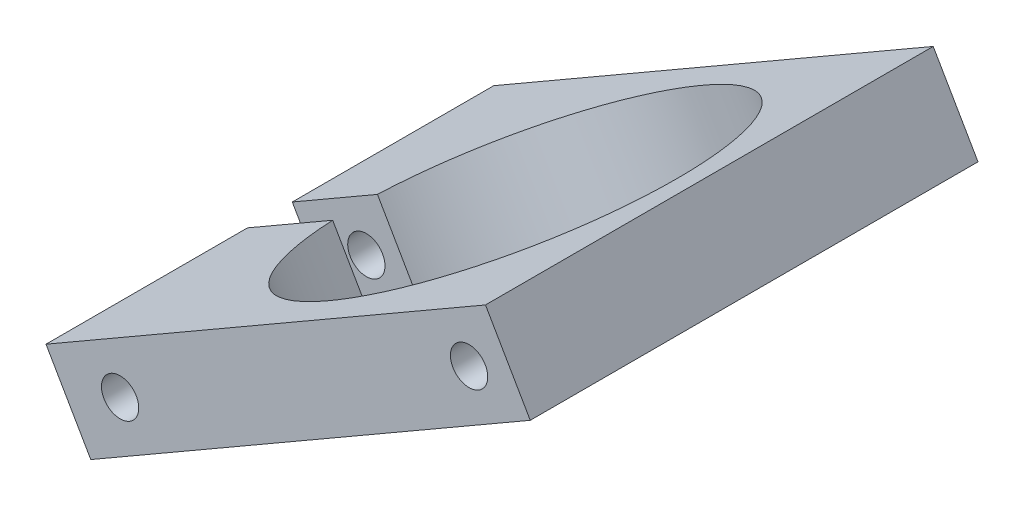
ISO-10303-21;
HEADER;
FILE_DESCRIPTION(('STEP AP214'),'2;1');
FILE_NAME('part.step','',(''),(''),'','','');
FILE_SCHEMA(('AUTOMOTIVE_DESIGN { 1 0 10303 214 1 1 1 1 }'));
ENDSEC;
DATA;
#1=APPLICATION_CONTEXT('core data for automotive mechanical design processes');
#2=APPLICATION_PROTOCOL_DEFINITION('international standard','automotive_design',2000,#1);
#3=PRODUCT_CONTEXT('',#1,'mechanical');
#4=PRODUCT('Part','Part','',(#3));
#5=PRODUCT_RELATED_PRODUCT_CATEGORY('part','',(#4));
#6=PRODUCT_DEFINITION_FORMATION('','',#4);
#7=PRODUCT_DEFINITION_CONTEXT('part definition',#1,'design');
#8=PRODUCT_DEFINITION('design','',#6,#7);
#9=PRODUCT_DEFINITION_SHAPE('','',#8);
#10=(LENGTH_UNIT() NAMED_UNIT(*) SI_UNIT(.MILLI.,.METRE.));
#11=(NAMED_UNIT(*) PLANE_ANGLE_UNIT() SI_UNIT($,.RADIAN.));
#12=(NAMED_UNIT(*) SI_UNIT($,.STERADIAN.) SOLID_ANGLE_UNIT());
#13=UNCERTAINTY_MEASURE_WITH_UNIT(LENGTH_MEASURE(1.E-05),#10,'distance_accuracy_value','');
#14=(GEOMETRIC_REPRESENTATION_CONTEXT(3) GLOBAL_UNCERTAINTY_ASSIGNED_CONTEXT((#13)) GLOBAL_UNIT_ASSIGNED_CONTEXT((#10,
#11,#12)) REPRESENTATION_CONTEXT('',''));
#15=CARTESIAN_POINT('',(0.,0.,0.));
#16=DIRECTION('',(0.,0.,1.));
#17=DIRECTION('',(1.,0.,0.));
#18=AXIS2_PLACEMENT_3D('',#15,#16,#17);
#19=CARTESIAN_POINT('',(-53.9903810567648,730.846095396544,-386.357743681072));
#20=DIRECTION('',(0.,0.,-1.));
#21=DIRECTION('',(0.,1.,0.));
#22=AXIS2_PLACEMENT_3D('',#19,#20,#21);
#23=CYLINDRICAL_SURFACE('',#22,1.25);
#24=CARTESIAN_POINT('',(-53.9903810567648,730.846095396544,-387.857743681072));
#25=DIRECTION('',(0.,0.,-1.));
#26=DIRECTION('',(0.,1.,0.));
#27=AXIS2_PLACEMENT_3D('',#24,#25,#26);
#28=CIRCLE('',#27,1.25);
#29=CARTESIAN_POINT('',(-53.9903810567648,732.096095396544,-387.857743681072));
#30=VERTEX_POINT('',#29);
#31=EDGE_CURVE('E129',#30,#30,#28,.T.);
#32=ORIENTED_EDGE('',*,*,#31,.F.);
#33=EDGE_LOOP('',(#32));
#34=FACE_BOUND('',#33,.T.);
#35=CARTESIAN_POINT('',(-53.9903810567648,730.846095396544,-401.357743681072));
#36=DIRECTION('',(0.,0.,-1.));
#37=DIRECTION('',(0.,1.,0.));
#38=AXIS2_PLACEMENT_3D('',#35,#36,#37);
#39=CIRCLE('',#38,1.25);
#40=CARTESIAN_POINT('',(-53.9903810567648,732.096095396544,-401.357743681072));
#41=VERTEX_POINT('',#40);
#42=EDGE_CURVE('E147',#41,#41,#39,.T.);
#43=ORIENTED_EDGE('',*,*,#42,.T.);
#44=EDGE_LOOP('',(#43));
#45=FACE_BOUND('',#44,.T.);
#46=ADVANCED_FACE('F17',(#34,#45),#23,.F.);
#47=CARTESIAN_POINT('',(-30.6076951545847,744.346095396544,-386.357743681072));
#48=DIRECTION('',(0.,0.,-1.));
#49=DIRECTION('',(0.,1.,0.));
#50=AXIS2_PLACEMENT_3D('',#47,#48,#49);
#51=CYLINDRICAL_SURFACE('',#50,1.25);
#52=CARTESIAN_POINT('',(-31.6902269093152,743.721095396544,-392.736419092158));
#53=CARTESIAN_POINT('',(-31.6712542976845,743.688237965166,-392.736415954482));
#54=CARTESIAN_POINT('',(-31.6507622655718,743.656229801123,-392.733481741806));
#55=CARTESIAN_POINT('',(-31.6074845193841,743.594872017348,-392.721998875564));
#56=CARTESIAN_POINT('',(-31.5846961443095,743.565525558555,-392.713443643527));
#57=CARTESIAN_POINT('',(-31.5378354571018,743.510245694467,-392.691473109543));
#58=CARTESIAN_POINT('',(-31.513772796748,743.484290688874,-392.678090836825));
#59=CARTESIAN_POINT('',(-31.4649407412492,743.435700569152,-392.647285870885));
#60=CARTESIAN_POINT('',(-31.4401711547138,743.413066364464,-392.629862074201));
#61=CARTESIAN_POINT('',(-31.3739636054956,743.35702018795,-392.579119477516));
#62=CARTESIAN_POINT('',(-31.3323627876157,743.326412250539,-392.542921400854));
#63=CARTESIAN_POINT('',(-31.2501250278873,743.272684067325,-392.464366687458));
#64=CARTESIAN_POINT('',(-31.2094915239815,743.249587642206,-392.421991063912));
#65=CARTESIAN_POINT('',(-31.1354773129869,743.212335848741,-392.339239642249));
#66=CARTESIAN_POINT('',(-31.1018751560204,743.19738292426,-392.299408491014));
#67=CARTESIAN_POINT('',(-31.0360801007505,743.171260168537,-392.217390405548));
#68=CARTESIAN_POINT('',(-31.0038882991715,743.160093237446,-392.175201694062));
#69=CARTESIAN_POINT('',(-30.9094768450195,743.131277095559,-392.045880474075));
#70=CARTESIAN_POINT('',(-30.849488166336,743.118343446408,-391.956069829444));
#71=CARTESIAN_POINT('',(-30.7340969321446,743.101109237027,-391.769982309981));
#72=CARTESIAN_POINT('',(-30.6788363192431,743.097019993482,-391.673602763511));
#73=CARTESIAN_POINT('',(-30.57399862631,743.09545123543,-391.477666883312));
#74=CARTESIAN_POINT('',(-30.5244276143746,743.097978710677,-391.378107299982));
#75=CARTESIAN_POINT('',(-30.4304649274879,743.107820939995,-391.176546350129));
#76=CARTESIAN_POINT('',(-30.3860863273501,743.115147485111,-391.074539567204));
#77=CARTESIAN_POINT('',(-30.3022244517654,743.133237429574,-390.868903153364));
#78=CARTESIAN_POINT('',(-30.2627391900478,743.143999428039,-390.765274200277));
#79=CARTESIAN_POINT('',(-30.1813897125951,743.170123224344,-390.537516039531));
#80=CARTESIAN_POINT('',(-30.1404243554547,743.185967015107,-390.41312291761));
#81=CARTESIAN_POINT('',(-30.064171997232,743.219677129357,-390.162862736091));
#82=CARTESIAN_POINT('',(-30.0288864687354,743.237543975316,-390.036995303299));
#83=CARTESIAN_POINT('',(-29.9634520294906,743.274246792725,-389.783935760655));
#84=CARTESIAN_POINT('',(-29.9333085538428,743.293083762549,-389.656742398102));
#85=CARTESIAN_POINT('',(-29.877739802605,743.330816993039,-389.401332739714));
#86=CARTESIAN_POINT('',(-29.8523150743081,743.349713260324,-389.27311632702));
#87=CARTESIAN_POINT('',(-29.7824933425282,743.405298411567,-388.887180746343));
#88=CARTESIAN_POINT('',(-29.744534715128,743.440892476346,-388.628119188457));
#89=CARTESIAN_POINT('',(-29.6829672398775,743.503884447574,-388.107524553003));
#90=CARTESIAN_POINT('',(-29.6593477252183,743.531288438863,-387.845993459961));
#91=CARTESIAN_POINT('',(-29.6282046773068,743.569210266974,-387.379873878627));
#92=CARTESIAN_POINT('',(-29.6182618788654,743.582134658435,-387.175640818058));
#93=CARTESIAN_POINT('',(-29.6050941641375,743.599493500826,-386.766852730232));
#94=CARTESIAN_POINT('',(-29.6018606041002,743.60393887498,-386.562298457445));
#95=CARTESIAN_POINT('',(-29.6018603748356,743.603938429543,-386.148294362564));
#96=CARTESIAN_POINT('',(-29.6052502953014,743.599277318255,-385.938844516084));
#97=CARTESIAN_POINT('',(-29.6190549460035,743.581099911121,-385.52052600228));
#98=CARTESIAN_POINT('',(-29.6294711089759,743.567581809242,-385.311657462217));
#99=CARTESIAN_POINT('',(-29.658076028985,743.53293668976,-384.894287188887));
#100=CARTESIAN_POINT('',(-29.6762943687451,743.511780761006,-384.685789915798));
#101=CARTESIAN_POINT('',(-29.7215678150664,743.463846163135,-384.270439728651));
#102=CARTESIAN_POINT('',(-29.7486216006178,743.437068334775,-384.063586573509));
#103=CARTESIAN_POINT('',(-29.8130861500548,743.380200047019,-383.650786127465));
#104=CARTESIAN_POINT('',(-29.8505522047719,743.35009243459,-383.444849807547));
#105=CARTESIAN_POINT('',(-29.9374406087149,743.289651912616,-383.035347622215));
#106=CARTESIAN_POINT('',(-29.9868704257778,743.259318873867,-382.831783320938));
#107=CARTESIAN_POINT('',(-30.071224417899,743.216637537293,-382.529666772488));
#108=CARTESIAN_POINT('',(-30.100923862872,743.202922742429,-382.429839224293));
#109=CARTESIAN_POINT('',(-30.1640212471644,743.176984780248,-382.231169680477));
#110=CARTESIAN_POINT('',(-30.1974186295211,743.164761388885,-382.132327538877));
#111=CARTESIAN_POINT('',(-30.2681689260807,743.142519377963,-381.935954464242));
#112=CARTESIAN_POINT('',(-30.3055167369318,743.132497964095,-381.838422018587));
#113=CARTESIAN_POINT('',(-30.3845258600304,743.115514075419,-381.644865434439));
#114=CARTESIAN_POINT('',(-30.4261855148307,743.108550430581,-381.548840732605));
#115=CARTESIAN_POINT('',(-30.4915703676895,743.101315817943,-381.407594903611));
#116=CARTESIAN_POINT('',(-30.5135098514463,743.099444538459,-381.361625675436));
#117=CARTESIAN_POINT('',(-30.5585386694158,743.096859011212,-381.270224064769));
#118=CARTESIAN_POINT('',(-30.5816280029285,743.096144762743,-381.22479168195));
#119=CARTESIAN_POINT('',(-30.6529122679509,743.096003017258,-381.08900017262));
#120=CARTESIAN_POINT('',(-30.7029352535289,743.098600594032,-380.999556589138));
#121=CARTESIAN_POINT('',(-30.7902518241658,743.109005990561,-380.854071291457));
#122=CARTESIAN_POINT('',(-30.8260936799123,743.11474300894,-380.797008844043));
#123=CARTESIAN_POINT('',(-30.9001323912273,743.130194869109,-380.684891357617));
#124=CARTESIAN_POINT('',(-30.9383309692257,743.139912650237,-380.62983783475));
#125=CARTESIAN_POINT('',(-31.0168005631336,743.164228106318,-380.522877801885));
#126=CARTESIAN_POINT('',(-31.0570564481365,743.178793561434,-380.470953118648));
#127=CARTESIAN_POINT('',(-31.1396640890967,743.214051457588,-380.371063361451));
#128=CARTESIAN_POINT('',(-31.1820113767418,743.234731269977,-380.323090384193));
#129=CARTESIAN_POINT('',(-31.2563160516613,743.276950715642,-380.245411655401));
#130=CARTESIAN_POINT('',(-31.2878810881587,743.2966456152,-380.214340262311));
#131=CARTESIAN_POINT('',(-31.3515011473762,743.340734482618,-380.156136231997));
#132=CARTESIAN_POINT('',(-31.3835565246722,743.365132014812,-380.129006609948));
#133=CARTESIAN_POINT('',(-31.4478033378293,743.419536124769,-380.079785112983));
#134=CARTESIAN_POINT('',(-31.4799914501878,743.449609120422,-380.057760582643));
#135=CARTESIAN_POINT('',(-31.5427764337927,743.515333446431,-380.021039072499));
#136=CARTESIAN_POINT('',(-31.5733783461319,743.550965450299,-380.006317418105));
#137=CARTESIAN_POINT('',(-31.6181326825975,743.609752148584,-379.990478000768));
#138=CARTESIAN_POINT('',(-31.6334395478382,743.631216556008,-379.986218317071));
#139=CARTESIAN_POINT('',(-31.6628196698265,743.675339153223,-379.980512329085));
#140=CARTESIAN_POINT('',(-31.6768928760687,743.697997391829,-379.979066139927));
#141=CARTESIAN_POINT('',(-31.7091967582173,743.753956096025,-379.979071300344));
#142=CARTESIAN_POINT('',(-31.7266705410666,743.787706870157,-379.982005689429));
#143=CARTESIAN_POINT('',(-31.7581687018654,743.855865045639,-379.993488795393));
#144=CARTESIAN_POINT('',(-31.7721891260331,743.890273151475,-380.002043906785));
#145=CARTESIAN_POINT('',(-31.7966323535405,743.958494993366,-380.024014189993));
#146=CARTESIAN_POINT('',(-31.8070786498028,743.992311167832,-380.037396388754));
#147=CARTESIAN_POINT('',(-31.8247429142316,744.058896012414,-380.068201318227));
#148=CARTESIAN_POINT('',(-31.8319599667148,744.091664382973,-380.085625192871));
#149=CARTESIAN_POINT('',(-31.8473937604114,744.177025718291,-380.136368272726));
#150=CARTESIAN_POINT('',(-31.8531006213553,744.22835765347,-380.172566850275));
#151=CARTESIAN_POINT('',(-31.8585115615589,744.32644161782,-380.251121717076));
#152=CARTESIAN_POINT('',(-31.8581968783765,744.37317887568,-380.29349684461));
#153=CARTESIAN_POINT('',(-31.8534509107869,744.455900556201,-380.376245861509));
#154=CARTESIAN_POINT('',(-31.8495997115077,744.492475646061,-380.416075004242));
#155=CARTESIAN_POINT('',(-31.8393259047053,744.562514103589,-380.498088865035));
#156=CARTESIAN_POINT('',(-31.8329013350788,744.595975072805,-380.540275359321));
#157=CARTESIAN_POINT('',(-31.8106513472265,744.692148250011,-380.669598135095));
#158=CARTESIAN_POINT('',(-31.7918570672581,744.750569866915,-380.759413054181));
#159=CARTESIAN_POINT('',(-31.7490816953565,744.859131455061,-380.945522413983));
#160=CARTESIAN_POINT('',(-31.7249878923575,744.909041460719,-381.041920146693));
#161=CARTESIAN_POINT('',(-31.6739172467335,745.00063156547,-381.237892890135));
#162=CARTESIAN_POINT('',(-31.6469373966145,745.04230294793,-381.337471137941));
#163=CARTESIAN_POINT('',(-31.5914315935445,745.118750416801,-381.539032702268));
#164=CARTESIAN_POINT('',(-31.5629025186309,745.153511868292,-381.641020622149));
#165=CARTESIAN_POINT('',(-31.505315506728,745.21707978762,-381.846620245664));
#166=CARTESIAN_POINT('',(-31.4762577812008,745.245888581934,-381.950231297833));
#167=CARTESIAN_POINT('',(-31.4129869149723,745.303252232642,-382.17788961091));
#168=CARTESIAN_POINT('',(-31.3788056637688,745.330791478016,-382.302199793624));
#169=CARTESIAN_POINT('',(-31.3115288529095,745.379948195715,-382.552292242471));
#170=CARTESIAN_POINT('',(-31.2784335750355,745.401564141628,-382.678074879359));
#171=CARTESIAN_POINT('',(-31.2139713348996,745.439866915058,-382.930953895139));
#172=CARTESIAN_POINT('',(-31.1826060898681,745.456548914301,-383.058051435751));
#173=CARTESIAN_POINT('',(-31.1221789780482,745.485801664009,-383.313268281298));
#174=CARTESIAN_POINT('',(-31.0931173752639,745.498371943773,-383.441387701498));
#175=CARTESIAN_POINT('',(-31.0100348830674,745.531078846527,-383.82736212664));
#176=CARTESIAN_POINT('',(-30.9601875238648,745.546173808246,-384.086561571914));
#177=CARTESIAN_POINT('',(-30.8747680573524,745.568028312081,-384.607521193495));
#178=CARTESIAN_POINT('',(-30.839189552712,745.574791592467,-384.869280168213));
#179=CARTESIAN_POINT('',(-30.7957598230708,745.581970835275,-385.287386094102));
#180=CARTESIAN_POINT('',(-30.7825184842412,745.583850708921,-385.443161407015));
#181=CARTESIAN_POINT('',(-30.7621789167057,745.586556547813,-385.755131046195));
#182=CARTESIAN_POINT('',(-30.7550807835504,745.587382496667,-385.91132537894));
#183=CARTESIAN_POINT('',(-30.7472243564328,745.58828969954,-386.223906715576));
#184=CARTESIAN_POINT('',(-30.7464673281852,745.588370804885,-386.380293751702));
#185=CARTESIAN_POINT('',(-30.751316475123,745.587819568756,-386.692965774246));
#186=CARTESIAN_POINT('',(-30.7569225800334,745.587187235161,-386.849250761774));
#187=CARTESIAN_POINT('',(-30.7743294434003,745.584969561753,-387.161202639928));
#188=CARTESIAN_POINT('',(-30.7861197716331,745.583385825911,-387.31687012797));
#189=CARTESIAN_POINT('',(-30.8155808184862,745.578777510987,-387.627630114725));
#190=CARTESIAN_POINT('',(-30.8332517750603,745.575752873598,-387.782722589915));
#191=CARTESIAN_POINT('',(-30.8740350057707,745.567567834762,-388.092087801964));
#192=CARTESIAN_POINT('',(-30.8971457720605,745.562408024857,-388.246360753889));
#193=CARTESIAN_POINT('',(-30.9482801222771,745.549091587217,-388.553945229169));
#194=CARTESIAN_POINT('',(-30.9763031769517,745.540935282222,-388.707256854257));
#195=CARTESIAN_POINT('',(-31.0280913344313,745.523502183337,-388.969429208505));
#196=CARTESIAN_POINT('',(-31.0508092534244,745.515199594725,-389.078562324954));
#197=CARTESIAN_POINT('',(-31.0981902300188,745.496123344361,-389.296165819672));
#198=CARTESIAN_POINT('',(-31.1228530019451,745.485350045086,-389.404636292763));
#199=CARTESIAN_POINT('',(-31.1994393704342,745.448624659181,-389.72929475983));
#200=CARTESIAN_POINT('',(-31.2539026929711,745.41828394279,-389.944441170725));
#201=CARTESIAN_POINT('',(-31.3436897256474,745.357247735579,-390.283773312812));
#202=CARTESIAN_POINT('',(-31.3777505744604,745.331753226944,-390.409238007981));
#203=CARTESIAN_POINT('',(-31.44642090134,745.274026642844,-390.658443682759));
#204=CARTESIAN_POINT('',(-31.4810302080518,745.241796634842,-390.782185178901));
#205=CARTESIAN_POINT('',(-31.5496257135583,745.169350461296,-391.027060577142));
#206=CARTESIAN_POINT('',(-31.5836135225004,745.129159585697,-391.148201423692));
#207=CARTESIAN_POINT('',(-31.6495384134478,745.039052208586,-391.387333716643));
#208=CARTESIAN_POINT('',(-31.6814776591946,744.989146201062,-391.505328406447));
#209=CARTESIAN_POINT('',(-31.7303992342027,744.897180873868,-391.695652926489));
#210=CARTESIAN_POINT('',(-31.7486683798876,744.858617322794,-391.769334634444));
#211=CARTESIAN_POINT('',(-31.7824256430866,744.775654319586,-391.914179772449));
#212=CARTESIAN_POINT('',(-31.7979104456303,744.731248018675,-391.985340120787));
#213=CARTESIAN_POINT('',(-31.8247881526732,744.635381065569,-392.124417879131));
#214=CARTESIAN_POINT('',(-31.8361504443113,744.583871406449,-392.192307906016));
#215=CARTESIAN_POINT('',(-31.8524913382811,744.473048246649,-392.322241559134));
#216=CARTESIAN_POINT('',(-31.8574866480543,744.41375562244,-392.384300089147));
#217=CARTESIAN_POINT('',(-31.8578021233147,744.314383244401,-392.473973059981));
#218=CARTESIAN_POINT('',(-31.8563949655879,744.277221853632,-392.504793571012));
#219=CARTESIAN_POINT('',(-31.849749309907,744.200155794309,-392.562471875908));
#220=CARTESIAN_POINT('',(-31.8445087033643,744.16024962694,-392.589327479102));
#221=CARTESIAN_POINT('',(-31.8292405689891,744.077549841768,-392.637985922234));
#222=CARTESIAN_POINT('',(-31.8191532629342,744.03472605848,-392.659720470504));
#223=CARTESIAN_POINT('',(-31.7933744397023,743.947723618206,-392.695856818427));
#224=CARTESIAN_POINT('',(-31.777702463367,743.903550170342,-392.710283766546));
#225=CARTESIAN_POINT('',(-31.7492484297674,743.83618454308,-392.725572200945));
#226=CARTESIAN_POINT('',(-31.7385261951858,743.812813242634,-392.729622326244));
#227=CARTESIAN_POINT('',(-31.7155162076754,743.766526795271,-392.735046964606));
#228=CARTESIAN_POINT('',(-31.7032283171439,743.743611688653,-392.736421242321));
#229=CARTESIAN_POINT('',(-31.6902269093152,743.721095396544,-392.736419092158));
#230=B_SPLINE_CURVE_WITH_KNOTS('',3,(#52,#53,#54,#55,#56,#57,#58,#59,#60,#61,#62,#63,#64,#65,
#66,#67,#68,#69,#70,#71,#72,#73,#74,#75,#76,#77,#78,#79,#80,#81,#82,#83,#84,#85,#86,#87,#88,#89,
#90,#91,#92,#93,#94,#95,#96,#97,#98,#99,#100,#101,#102,#103,#104,#105,#106,#107,#108,#109,#110,
#111,#112,#113,#114,#115,#116,#117,#118,#119,#120,#121,#122,#123,#124,#125,#126,#127,#128,#129,
#130,#131,#132,#133,#134,#135,#136,#137,#138,#139,#140,#141,#142,#143,#144,#145,#146,#147,#148,
#149,#150,#151,#152,#153,#154,#155,#156,#157,#158,#159,#160,#161,#162,#163,#164,#165,#166,#167,
#168,#169,#170,#171,#172,#173,#174,#175,#176,#177,#178,#179,#180,#181,#182,#183,#184,#185,#186,
#187,#188,#189,#190,#191,#192,#193,#194,#195,#196,#197,#198,#199,#200,#201,#202,#203,#204,#205,
#206,#207,#208,#209,#210,#211,#212,#213,#214,#215,#216,#217,#218,#219,#220,#221,#222,#223,#224,
#225,#226,#227,#228,#229),.UNSPECIFIED.,.T.,.F.,(4,2,2,2,2,2,2,2,2,2,2,2,2,2,2,2,2,2,2,2,2,2,2,
2,2,2,2,2,2,2,2,2,2,2,2,2,2,2,2,2,2,2,2,2,2,2,2,2,2,2,2,2,2,2,2,2,2,2,2,2,2,2,2,2,2,2,2,2,2,2,2,
2,2,2,2,2,2,2,2,2,2,2,2,2,2,2,2,2,4),(0.,0.113721890322121,0.227577110903508,0.340667608492806,
0.453789019754953,0.64191227493495,0.83062642208434,0.993034505980922,1.15556671828893,
1.48094764319125,1.81402066107442,2.14744567180106,2.48169297742735,2.81580416015113,
3.21138556181694,3.60706935960735,4.00316883417203,4.39931422076298,5.19142999368422,
5.98295579047686,6.59733783395703,7.21092785445132,7.83919972330954,8.46759974317034,
9.09840379712578,9.72911358112084,10.3632387257236,10.9977607197234,11.3128502480868,
11.6278923838019,11.9425323919409,12.257051900381,12.4099373098437,12.562822626234,
12.8699456203726,13.0726891086869,13.2755825705646,13.4771535795312,13.6783111360098,
13.8234251775952,13.9686496432008,14.115692811973,14.2622357159915,14.3421696291189,
14.4221068131767,14.5358305661644,14.6496839235338,14.7627738543581,14.8758958326348,
15.0640213961673,15.252733232604,15.4151334377516,15.5776577036932,15.903054433383,
16.2361888414608,16.5696738482143,16.9038578068533,17.2379109083134,17.6332305486883,
18.0286519658361,18.4244590647181,18.8203114588479,19.6128646814013,20.4050621705395,
20.8739969727793,21.3429390686483,21.811974765357,22.281005282038,22.7492472701271,
23.2175082074614,23.6856395013126,24.1537203894595,24.4890183952027,24.8242672411834,
25.4956485398555,25.8929566697942,26.2901430246808,26.6860872769545,27.0816061920149,
27.3368315385904,27.5923587667406,27.8497464209334,28.1064572705239,28.251053732159,
28.3957297889415,28.5422379338868,28.6882383986822,28.7661620224346,28.8440924994774),.UNSPECIFIED.);
#231=CARTESIAN_POINT('',(-31.6902269093152,743.721095396544,-392.736419092158));
#232=VERTEX_POINT('',#231);
#233=EDGE_CURVE('E88',#232,#232,#230,.T.);
#234=ORIENTED_EDGE('',*,*,#233,.T.);
#235=EDGE_LOOP('',(#234));
#236=FACE_BOUND('',#235,.T.);
#237=CARTESIAN_POINT('',(-30.6076951545847,744.346095396544,-401.357743681072));
#238=DIRECTION('',(0.,0.,-1.));
#239=DIRECTION('',(0.,1.,0.));
#240=AXIS2_PLACEMENT_3D('',#237,#238,#239);
#241=CIRCLE('',#240,1.25);
#242=CARTESIAN_POINT('',(-30.6076951545847,745.596095396544,-401.357743681072));
#243=VERTEX_POINT('',#242);
#244=EDGE_CURVE('E144',#243,#243,#241,.T.);
#245=ORIENTED_EDGE('',*,*,#244,.T.);
#246=EDGE_LOOP('',(#245));
#247=FACE_BOUND('',#246,.T.);
#248=CARTESIAN_POINT('',(-30.6076951545847,744.346095396544,-371.357743681072));
#249=DIRECTION('',(0.,0.,-1.));
#250=DIRECTION('',(0.,1.,0.));
#251=AXIS2_PLACEMENT_3D('',#248,#249,#250);
#252=CIRCLE('',#251,1.25);
#253=CARTESIAN_POINT('',(-30.6076951545847,745.596095396544,-371.357743681072));
#254=VERTEX_POINT('',#253);
#255=EDGE_CURVE('E139',#254,#254,#252,.F.);
#256=ORIENTED_EDGE('',*,*,#255,.T.);
#257=EDGE_LOOP('',(#256));
#258=FACE_BOUND('',#257,.T.);
#259=ADVANCED_FACE('F156',(#236,#247,#258),#51,.F.);
#260=CARTESIAN_POINT('',(-55.954482671903,726.248019185191,-371.357743681072));
#261=DIRECTION('',(0.5,-0.866025403784439,0.));
#262=DIRECTION('',(0.866025403784439,0.5,0.));
#263=AXIS2_PLACEMENT_3D('',#260,#261,#262);
#264=PLANE('',#263);
#265=DIRECTION('',(-0.866025403784443,-0.499999999999993,0.));
#266=VECTOR('',#265,1.);
#267=CARTESIAN_POINT('',(-26.5096189432315,743.248019185191,-371.357743681072));
#268=LINE('',#267,#266);
#269=CARTESIAN_POINT('',(-26.5096189432314,743.248019185191,-371.357743681072));
#270=VERTEX_POINT('',#269);
#271=CARTESIAN_POINT('',(-55.9544826719029,726.248019185191,-371.357743681072));
#272=VERTEX_POINT('',#271);
#273=EDGE_CURVE('E109',#270,#272,#268,.T.);
#274=ORIENTED_EDGE('',*,*,#273,.T.);
#275=DIRECTION('',(0.,0.,1.));
#276=VECTOR('',#275,1.);
#277=CARTESIAN_POINT('',(-55.9544826719029,726.248019185191,-384.857743681072));
#278=LINE('',#277,#276);
#279=CARTESIAN_POINT('',(-55.9544826719026,726.248019185191,-384.857743681072));
#280=VERTEX_POINT('',#279);
#281=EDGE_CURVE('E94',#272,#280,#278,.F.);
#282=ORIENTED_EDGE('',*,*,#281,.T.);
#283=DIRECTION('',(-0.866025403784399,-0.500000000000069,0.));
#284=VECTOR('',#283,1.);
#285=CARTESIAN_POINT('',(-50.2470926301007,729.543182362196,-384.857743681072));
#286=LINE('',#285,#284);
#287=CARTESIAN_POINT('',(-50.2470926301006,729.543182362196,-384.857743681072));
#288=VERTEX_POINT('',#287);
#289=EDGE_CURVE('E90',#288,#280,#286,.T.);
#290=ORIENTED_EDGE('',*,*,#289,.F.);
#291=CARTESIAN_POINT('',(-39.4999999999986,735.748019185191,-386.357743681072));
#292=DIRECTION('',(-0.5,0.866025403784439,0.));
#293=DIRECTION('',(-0.866025403784439,-0.5,0.));
#294=AXIS2_PLACEMENT_3D('',#291,#292,#293);
#295=CIRCLE('',#294,12.5);
#296=CARTESIAN_POINT('',(-50.2470926301006,729.543182362196,-387.857743681072));
#297=VERTEX_POINT('',#296);
#298=EDGE_CURVE('E20',#288,#297,#295,.T.);
#299=ORIENTED_EDGE('',*,*,#298,.T.);
#300=DIRECTION('',(0.866025403784399,0.500000000000069,0.));
#301=VECTOR('',#300,1.);
#302=CARTESIAN_POINT('',(-55.9544826719025,726.248019185191,-387.857743681072));
#303=LINE('',#302,#301);
#304=CARTESIAN_POINT('',(-55.9544826719027,726.248019185191,-387.857743681072));
#305=VERTEX_POINT('',#304);
#306=EDGE_CURVE('E132',#305,#297,#303,.T.);
#307=ORIENTED_EDGE('',*,*,#306,.F.);
#308=DIRECTION('',(0.,0.,1.));
#309=VECTOR('',#308,1.);
#310=CARTESIAN_POINT('',(-55.9544826719027,726.248019185191,-401.357743681072));
#311=LINE('',#310,#309);
#312=CARTESIAN_POINT('',(-55.9544826719029,726.248019185191,-401.357743681072));
#313=VERTEX_POINT('',#312);
#314=EDGE_CURVE('E126',#305,#313,#311,.F.);
#315=ORIENTED_EDGE('',*,*,#314,.T.);
#316=DIRECTION('',(0.866025403784443,0.499999999999993,0.));
#317=VECTOR('',#316,1.);
#318=CARTESIAN_POINT('',(-55.954482671903,726.248019185191,-401.357743681072));
#319=LINE('',#318,#317);
#320=CARTESIAN_POINT('',(-26.5096189432314,743.248019185191,-401.357743681072));
#321=VERTEX_POINT('',#320);
#322=EDGE_CURVE('E120',#313,#321,#319,.T.);
#323=ORIENTED_EDGE('',*,*,#322,.T.);
#324=DIRECTION('',(0.,0.,1.));
#325=VECTOR('',#324,1.);
#326=CARTESIAN_POINT('',(-26.5096189432313,743.248019185191,-401.357743681072));
#327=LINE('',#326,#325);
#328=EDGE_CURVE('E115',#321,#270,#327,.T.);
#329=ORIENTED_EDGE('',*,*,#328,.T.);
#330=EDGE_LOOP('',(#274,#282,#290,#299,#307,#315,#323,#329));
#331=FACE_BOUND('',#330,.T.);
#332=ADVANCED_FACE('F92',(#331),#264,.T.);
#333=CARTESIAN_POINT('',(-53.9903810567648,730.846095396544,-386.357743681072));
#334=DIRECTION('',(0.,0.,-1.));
#335=DIRECTION('',(0.,1.,0.));
#336=AXIS2_PLACEMENT_3D('',#333,#334,#335);
#337=CYLINDRICAL_SURFACE('',#336,1.25);
#338=CARTESIAN_POINT('',(-53.9903810567648,730.846095396544,-371.357743681072));
#339=DIRECTION('',(0.,0.,-1.));
#340=DIRECTION('',(0.,1.,0.));
#341=AXIS2_PLACEMENT_3D('',#338,#339,#340);
#342=CIRCLE('',#341,1.25);
#343=CARTESIAN_POINT('',(-53.9903810567648,732.096095396544,-371.357743681072));
#344=VERTEX_POINT('',#343);
#345=EDGE_CURVE('E111',#344,#344,#342,.F.);
#346=ORIENTED_EDGE('',*,*,#345,.T.);
#347=EDGE_LOOP('',(#346));
#348=FACE_BOUND('',#347,.T.);
#349=CARTESIAN_POINT('',(-53.9903810567648,730.846095396544,-384.857743681072));
#350=DIRECTION('',(0.,0.,-1.));
#351=DIRECTION('',(0.,1.,0.));
#352=AXIS2_PLACEMENT_3D('',#349,#350,#351);
#353=CIRCLE('',#352,1.25);
#354=CARTESIAN_POINT('',(-53.9903810567648,732.096095396544,-384.857743681072));
#355=VERTEX_POINT('',#354);
#356=EDGE_CURVE('E95',#355,#355,#353,.F.);
#357=ORIENTED_EDGE('',*,*,#356,.F.);
#358=EDGE_LOOP('',(#357));
#359=FACE_BOUND('',#358,.T.);
#360=ADVANCED_FACE('F164',(#348,#359),#337,.F.);
#361=CARTESIAN_POINT('',(-40.9999999999982,738.346095396544,-386.357743681072));
#362=DIRECTION('',(-0.5,0.866025403784439,0.));
#363=DIRECTION('',(-0.866025403784439,-0.5,0.));
#364=AXIS2_PLACEMENT_3D('',#361,#362,#363);
#365=CYLINDRICAL_SURFACE('',#364,12.5);
#366=ORIENTED_EDGE('',*,*,#233,.F.);
#367=EDGE_LOOP('',(#366));
#368=FACE_BOUND('',#367,.T.);
#369=CARTESIAN_POINT('',(-42.4999999999983,740.944171607897,-386.357743681072));
#370=DIRECTION('',(-0.5,0.866025403784439,0.));
#371=DIRECTION('',(-0.866025403784439,-0.5,0.));
#372=AXIS2_PLACEMENT_3D('',#369,#370,#371);
#373=CIRCLE('',#372,12.5);
#374=CARTESIAN_POINT('',(-53.2470926301006,734.739334784902,-384.857743681072));
#375=VERTEX_POINT('',#374);
#376=CARTESIAN_POINT('',(-53.2470926301006,734.739334784902,-387.857743681072));
#377=VERTEX_POINT('',#376);
#378=EDGE_CURVE('E98',#375,#377,#373,.T.);
#379=ORIENTED_EDGE('',*,*,#378,.T.);
#380=DIRECTION('',(-0.500000000000047,0.866025403784412,0.));
#381=VECTOR('',#380,1.);
#382=CARTESIAN_POINT('',(-50.2470926301007,729.543182362196,-387.857743681072));
#383=LINE('',#382,#381);
#384=EDGE_CURVE('E84',#297,#377,#383,.T.);
#385=ORIENTED_EDGE('',*,*,#384,.F.);
#386=ORIENTED_EDGE('',*,*,#298,.F.);
#387=DIRECTION('',(0.500000000000047,-0.866025403784412,0.));
#388=VECTOR('',#387,1.);
#389=CARTESIAN_POINT('',(-53.2470926301007,734.739334784902,-384.857743681072));
#390=LINE('',#389,#388);
#391=EDGE_CURVE('E83',#375,#288,#390,.T.);
#392=ORIENTED_EDGE('',*,*,#391,.F.);
#393=EDGE_LOOP('',(#379,#385,#386,#392));
#394=FACE_BOUND('',#393,.T.);
#395=ADVANCED_FACE('F82',(#368,#394),#365,.F.);
#396=CARTESIAN_POINT('',(-55.2894191624414,730.096095396544,-387.857743681072));
#397=DIRECTION('',(0.,0.,1.));
#398=DIRECTION('',(1.,0.,0.));
#399=AXIS2_PLACEMENT_3D('',#396,#397,#398);
#400=PLANE('',#399);
#401=ORIENTED_EDGE('',*,*,#31,.T.);
#402=EDGE_LOOP('',(#401));
#403=FACE_BOUND('',#402,.T.);
#404=ORIENTED_EDGE('',*,*,#384,.T.);
#405=DIRECTION('',(0.866025403784438,0.500000000000001,0.));
#406=VECTOR('',#405,1.);
#407=CARTESIAN_POINT('',(-58.9544826719029,731.444171607897,-387.857743681072));
#408=LINE('',#407,#406);
#409=CARTESIAN_POINT('',(-58.9544826719023,731.444171607897,-387.857743681072));
#410=VERTEX_POINT('',#409);
#411=EDGE_CURVE('E137',#377,#410,#408,.F.);
#412=ORIENTED_EDGE('',*,*,#411,.T.);
#413=DIRECTION('',(-0.499999999999996,0.866025403784441,0.));
#414=VECTOR('',#413,1.);
#415=CARTESIAN_POINT('',(-55.9544826719028,726.248019185191,-387.857743681072));
#416=LINE('',#415,#414);
#417=EDGE_CURVE('E123',#410,#305,#416,.F.);
#418=ORIENTED_EDGE('',*,*,#417,.T.);
#419=ORIENTED_EDGE('',*,*,#306,.T.);
#420=EDGE_LOOP('',(#404,#412,#418,#419));
#421=FACE_BOUND('',#420,.T.);
#422=ADVANCED_FACE('F163',(#403,#421),#400,.T.);
#423=CARTESIAN_POINT('',(-55.9544826719028,726.248019185191,-401.357743681072));
#424=DIRECTION('',(0.866025403784441,0.499999999999996,0.));
#425=DIRECTION('',(-0.499999999999996,0.866025403784441,0.));
#426=AXIS2_PLACEMENT_3D('',#423,#424,#425);
#427=PLANE('',#426);
#428=DIRECTION('',(0.,0.,1.));
#429=VECTOR('',#428,1.);
#430=CARTESIAN_POINT('',(-58.9544826719022,731.444171607897,-371.357743681072));
#431=LINE('',#430,#429);
#432=CARTESIAN_POINT('',(-58.9544826719024,731.444171607897,-401.357743681072));
#433=VERTEX_POINT('',#432);
#434=EDGE_CURVE('E211',#410,#433,#431,.F.);
#435=ORIENTED_EDGE('',*,*,#434,.T.);
#436=DIRECTION('',(0.500000000000038,-0.866025403784417,0.));
#437=VECTOR('',#436,1.);
#438=CARTESIAN_POINT('',(-58.954482671903,731.444171607897,-401.357743681072));
#439=LINE('',#438,#437);
#440=EDGE_CURVE('E122',#433,#313,#439,.T.);
#441=ORIENTED_EDGE('',*,*,#440,.T.);
#442=ORIENTED_EDGE('',*,*,#314,.F.);
#443=ORIENTED_EDGE('',*,*,#417,.F.);
#444=EDGE_LOOP('',(#435,#441,#442,#443));
#445=FACE_BOUND('',#444,.T.);
#446=ADVANCED_FACE('F200',(#445),#427,.F.);
#447=CARTESIAN_POINT('',(-68.5656986040707,742.895133502221,-401.357743681072));
#448=DIRECTION('',(0.,0.,1.));
#449=DIRECTION('',(1.,0.,0.));
#450=AXIS2_PLACEMENT_3D('',#447,#448,#449);
#451=PLANE('',#450);
#452=ORIENTED_EDGE('',*,*,#244,.F.);
#453=EDGE_LOOP('',(#452));
#454=FACE_BOUND('',#453,.T.);
#455=ORIENTED_EDGE('',*,*,#42,.F.);
#456=EDGE_LOOP('',(#455));
#457=FACE_BOUND('',#456,.T.);
#458=DIRECTION('',(0.866025403784438,0.500000000000001,0.));
#459=VECTOR('',#458,1.);
#460=CARTESIAN_POINT('',(-58.9544826719029,731.444171607897,-401.357743681072));
#461=LINE('',#460,#459);
#462=CARTESIAN_POINT('',(-29.5096189432312,748.444171607897,-401.357743681072));
#463=VERTEX_POINT('',#462);
#464=EDGE_CURVE('E216',#433,#463,#461,.T.);
#465=ORIENTED_EDGE('',*,*,#464,.T.);
#466=DIRECTION('',(0.499999999999998,-0.86602540378444,0.));
#467=VECTOR('',#466,1.);
#468=CARTESIAN_POINT('',(-29.5096189432315,748.444171607898,-401.357743681072));
#469=LINE('',#468,#467);
#470=EDGE_CURVE('E117',#463,#321,#469,.T.);
#471=ORIENTED_EDGE('',*,*,#470,.T.);
#472=ORIENTED_EDGE('',*,*,#322,.F.);
#473=ORIENTED_EDGE('',*,*,#440,.F.);
#474=EDGE_LOOP('',(#465,#471,#472,#473));
#475=FACE_BOUND('',#474,.T.);
#476=ADVANCED_FACE('F197',(#454,#457,#475),#451,.F.);
#477=CARTESIAN_POINT('',(-29.5096189432315,748.444171607898,-401.357743681072));
#478=DIRECTION('',(-0.86602540378444,-0.499999999999998,0.));
#479=DIRECTION('',(0.499999999999998,-0.86602540378444,0.));
#480=AXIS2_PLACEMENT_3D('',#477,#478,#479);
#481=PLANE('',#480);
#482=ORIENTED_EDGE('',*,*,#328,.F.);
#483=ORIENTED_EDGE('',*,*,#470,.F.);
#484=DIRECTION('',(0.,0.,1.));
#485=VECTOR('',#484,1.);
#486=CARTESIAN_POINT('',(-29.5096189432312,748.444171607898,-371.357743681072));
#487=LINE('',#486,#485);
#488=CARTESIAN_POINT('',(-29.5096189432312,748.444171607897,-371.357743681072));
#489=VERTEX_POINT('',#488);
#490=EDGE_CURVE('E219',#463,#489,#487,.T.);
#491=ORIENTED_EDGE('',*,*,#490,.T.);
#492=DIRECTION('',(0.499999999999966,-0.866025403784458,0.));
#493=VECTOR('',#492,1.);
#494=CARTESIAN_POINT('',(-29.5096189432315,748.444171607898,-371.357743681072));
#495=LINE('',#494,#493);
#496=EDGE_CURVE('E112',#489,#270,#495,.T.);
#497=ORIENTED_EDGE('',*,*,#496,.T.);
#498=EDGE_LOOP('',(#482,#483,#491,#497));
#499=FACE_BOUND('',#498,.T.);
#500=ADVANCED_FACE('F193',(#499),#481,.F.);
#501=CARTESIAN_POINT('',(-50.8432667397352,712.198981079514,-371.357743681072));
#502=DIRECTION('',(0.,0.,-1.));
#503=DIRECTION('',(-1.,0.,0.));
#504=AXIS2_PLACEMENT_3D('',#501,#502,#503);
#505=PLANE('',#504);
#506=ORIENTED_EDGE('',*,*,#255,.F.);
#507=EDGE_LOOP('',(#506));
#508=FACE_BOUND('',#507,.T.);
#509=ORIENTED_EDGE('',*,*,#345,.F.);
#510=EDGE_LOOP('',(#509));
#511=FACE_BOUND('',#510,.T.);
#512=ORIENTED_EDGE('',*,*,#273,.F.);
#513=ORIENTED_EDGE('',*,*,#496,.F.);
#514=DIRECTION('',(0.866025403784438,0.500000000000001,0.));
#515=VECTOR('',#514,1.);
#516=CARTESIAN_POINT('',(-58.9544826719029,731.444171607897,-371.357743681072));
#517=LINE('',#516,#515);
#518=CARTESIAN_POINT('',(-58.9544826719028,731.444171607897,-371.357743681072));
#519=VERTEX_POINT('',#518);
#520=EDGE_CURVE('E234',#489,#519,#517,.F.);
#521=ORIENTED_EDGE('',*,*,#520,.T.);
#522=DIRECTION('',(-0.499999999999996,0.866025403784441,0.));
#523=VECTOR('',#522,1.);
#524=CARTESIAN_POINT('',(-55.9544826719028,726.248019185191,-371.357743681072));
#525=LINE('',#524,#523);
#526=EDGE_CURVE('E106',#519,#272,#525,.F.);
#527=ORIENTED_EDGE('',*,*,#526,.T.);
#528=EDGE_LOOP('',(#512,#513,#521,#527));
#529=FACE_BOUND('',#528,.T.);
#530=ADVANCED_FACE('F189',(#508,#511,#529),#505,.F.);
#531=CARTESIAN_POINT('',(-55.9544826719028,726.248019185191,-384.857743681072));
#532=DIRECTION('',(0.866025403784441,0.499999999999996,0.));
#533=DIRECTION('',(-0.499999999999996,0.866025403784441,0.));
#534=AXIS2_PLACEMENT_3D('',#531,#532,#533);
#535=PLANE('',#534);
#536=ORIENTED_EDGE('',*,*,#281,.F.);
#537=ORIENTED_EDGE('',*,*,#526,.F.);
#538=DIRECTION('',(0.,0.,1.));
#539=VECTOR('',#538,1.);
#540=CARTESIAN_POINT('',(-58.954482671903,731.444171607897,-371.357743681072));
#541=LINE('',#540,#539);
#542=CARTESIAN_POINT('',(-58.9544826719027,731.444171607897,-384.857743681072));
#543=VERTEX_POINT('',#542);
#544=EDGE_CURVE('E26',#519,#543,#541,.F.);
#545=ORIENTED_EDGE('',*,*,#544,.T.);
#546=DIRECTION('',(-0.499999999999967,0.866025403784458,0.));
#547=VECTOR('',#546,1.);
#548=CARTESIAN_POINT('',(-55.9544826719025,726.248019185191,-384.857743681072));
#549=LINE('',#548,#547);
#550=EDGE_CURVE('E34',#280,#543,#549,.T.);
#551=ORIENTED_EDGE('',*,*,#550,.F.);
#552=EDGE_LOOP('',(#536,#537,#545,#551));
#553=FACE_BOUND('',#552,.T.);
#554=ADVANCED_FACE('F182',(#553),#535,.F.);
#555=CARTESIAN_POINT('',(-55.2894191624414,730.096095396544,-384.857743681072));
#556=DIRECTION('',(0.,0.,-1.));
#557=DIRECTION('',(-1.,0.,0.));
#558=AXIS2_PLACEMENT_3D('',#555,#556,#557);
#559=PLANE('',#558);
#560=ORIENTED_EDGE('',*,*,#356,.T.);
#561=EDGE_LOOP('',(#560));
#562=FACE_BOUND('',#561,.T.);
#563=ORIENTED_EDGE('',*,*,#391,.T.);
#564=ORIENTED_EDGE('',*,*,#289,.T.);
#565=ORIENTED_EDGE('',*,*,#550,.T.);
#566=DIRECTION('',(0.866025403784438,0.500000000000001,0.));
#567=VECTOR('',#566,1.);
#568=CARTESIAN_POINT('',(-58.9544826719029,731.444171607897,-384.857743681072));
#569=LINE('',#568,#567);
#570=EDGE_CURVE('E11',#543,#375,#569,.T.);
#571=ORIENTED_EDGE('',*,*,#570,.T.);
#572=EDGE_LOOP('',(#563,#564,#565,#571));
#573=FACE_BOUND('',#572,.T.);
#574=ADVANCED_FACE('F89',(#562,#573),#559,.T.);
#575=CARTESIAN_POINT('',(-58.9544826719029,731.444171607897,-371.357743681072));
#576=DIRECTION('',(0.500000000000001,-0.866025403784438,0.));
#577=DIRECTION('',(0.866025403784438,0.500000000000001,0.));
#578=AXIS2_PLACEMENT_3D('',#575,#576,#577);
#579=PLANE('',#578);
#580=ORIENTED_EDGE('',*,*,#544,.F.);
#581=ORIENTED_EDGE('',*,*,#520,.F.);
#582=ORIENTED_EDGE('',*,*,#490,.F.);
#583=ORIENTED_EDGE('',*,*,#464,.F.);
#584=ORIENTED_EDGE('',*,*,#434,.F.);
#585=ORIENTED_EDGE('',*,*,#411,.F.);
#586=ORIENTED_EDGE('',*,*,#378,.F.);
#587=ORIENTED_EDGE('',*,*,#570,.F.);
#588=EDGE_LOOP('',(#580,#581,#582,#583,#584,#585,#586,#587));
#589=FACE_BOUND('',#588,.T.);
#590=ADVANCED_FACE('F175',(#589),#579,.F.);
#591=CLOSED_SHELL('',(#46,#259,#332,#360,#395,#422,#446,#476,#500,#530,#554,#574,#590));
#592=MANIFOLD_SOLID_BREP('B1',#591);
#593=ADVANCED_BREP_SHAPE_REPRESENTATION('',(#18,#592),#14);
#594=SHAPE_DEFINITION_REPRESENTATION(#9,#593);
ENDSEC;
END-ISO-10303-21;
